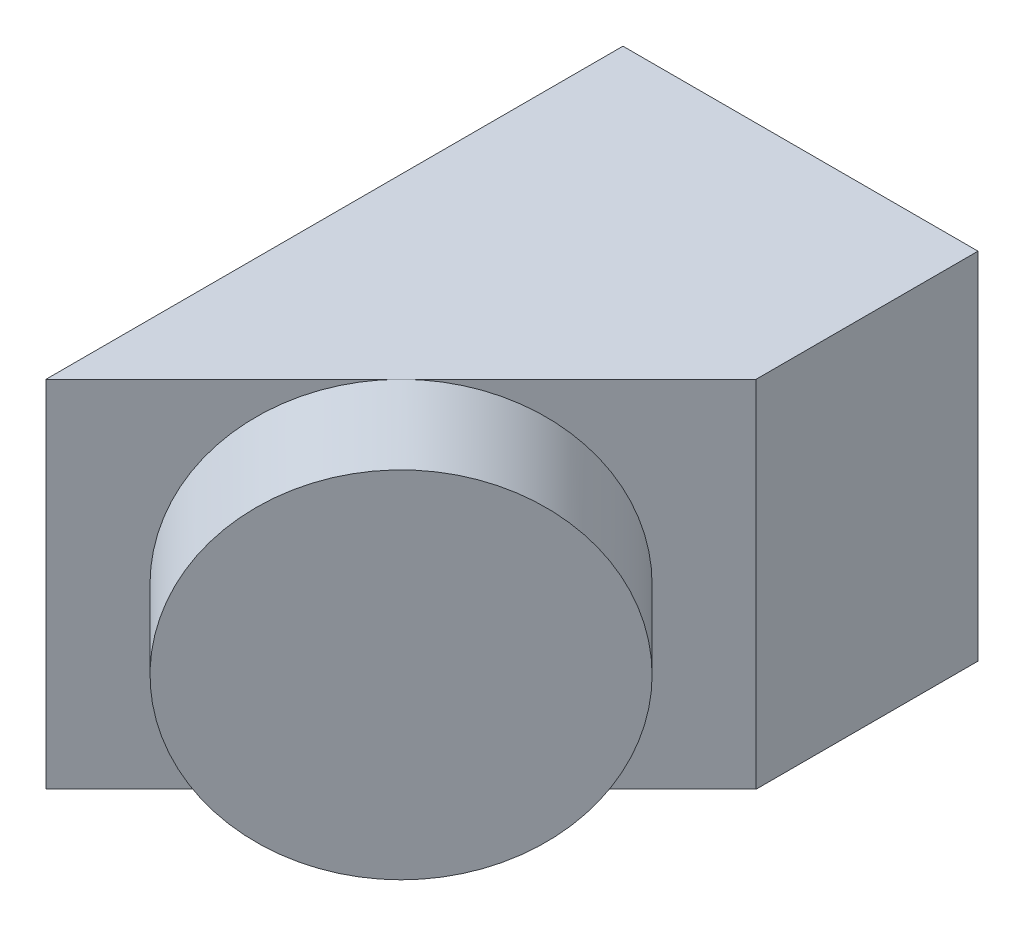
ISO-10303-21;
HEADER;
FILE_DESCRIPTION(('STEP AP214'),'2;1');
FILE_NAME('part.step','',(''),(''),'','','');
FILE_SCHEMA(('AUTOMOTIVE_DESIGN { 1 0 10303 214 1 1 1 1 }'));
ENDSEC;
DATA;
#1=APPLICATION_CONTEXT('core data for automotive mechanical design processes');
#2=APPLICATION_PROTOCOL_DEFINITION('international standard','automotive_design',2000,#1);
#3=PRODUCT_CONTEXT('',#1,'mechanical');
#4=PRODUCT('Part','Part','',(#3));
#5=PRODUCT_RELATED_PRODUCT_CATEGORY('part','',(#4));
#6=PRODUCT_DEFINITION_FORMATION('','',#4);
#7=PRODUCT_DEFINITION_CONTEXT('part definition',#1,'design');
#8=PRODUCT_DEFINITION('design','',#6,#7);
#9=PRODUCT_DEFINITION_SHAPE('','',#8);
#10=(LENGTH_UNIT() NAMED_UNIT(*) SI_UNIT(.MILLI.,.METRE.));
#11=(NAMED_UNIT(*) PLANE_ANGLE_UNIT() SI_UNIT($,.RADIAN.));
#12=(NAMED_UNIT(*) SI_UNIT($,.STERADIAN.) SOLID_ANGLE_UNIT());
#13=UNCERTAINTY_MEASURE_WITH_UNIT(LENGTH_MEASURE(1.E-05),#10,'distance_accuracy_value','');
#14=(GEOMETRIC_REPRESENTATION_CONTEXT(3) GLOBAL_UNCERTAINTY_ASSIGNED_CONTEXT((#13)) GLOBAL_UNIT_ASSIGNED_CONTEXT((#10,
#11,#12)) REPRESENTATION_CONTEXT('',''));
#15=CARTESIAN_POINT('',(0.,0.,0.));
#16=DIRECTION('',(0.,0.,1.));
#17=DIRECTION('',(1.,0.,0.));
#18=AXIS2_PLACEMENT_3D('',#15,#16,#17);
#19=CARTESIAN_POINT('',(0.,16.,26.));
#20=DIRECTION('',(0.707106781186548,0.,0.707106781186548));
#21=DIRECTION('',(0.707106781186548,0.,-0.707106781186548));
#22=AXIS2_PLACEMENT_3D('',#19,#20,#21);
#23=PLANE('',#22);
#24=CARTESIAN_POINT('',(8.00000000000001,8.,18.));
#25=DIRECTION('',(0.707106781186548,0.,0.707106781186547));
#26=DIRECTION('',(0.707106781186547,0.,-0.707106781186548));
#27=AXIS2_PLACEMENT_3D('',#24,#25,#26);
#28=CIRCLE('',#27,8.);
#29=CARTESIAN_POINT('',(8.00000000000001,16.,18.));
#30=VERTEX_POINT('',#29);
#31=CARTESIAN_POINT('',(8.00000000000001,0.,18.));
#32=VERTEX_POINT('',#31);
#33=EDGE_CURVE('E49',#30,#32,#28,.T.);
#34=ORIENTED_EDGE('',*,*,#33,.F.);
#35=DIRECTION('',(-0.707106781186548,0.,0.707106781186548));
#36=VECTOR('',#35,1.);
#37=CARTESIAN_POINT('',(0.,16.,26.));
#38=LINE('',#37,#36);
#39=CARTESIAN_POINT('',(0.,16.,26.));
#40=VERTEX_POINT('',#39);
#41=EDGE_CURVE('E120',#30,#40,#38,.T.);
#42=ORIENTED_EDGE('',*,*,#41,.T.);
#43=DIRECTION('',(0.,-1.,0.));
#44=VECTOR('',#43,1.);
#45=CARTESIAN_POINT('',(0.,16.,26.));
#46=LINE('',#45,#44);
#47=CARTESIAN_POINT('',(0.,0.,26.));
#48=VERTEX_POINT('',#47);
#49=EDGE_CURVE('E119',#40,#48,#46,.T.);
#50=ORIENTED_EDGE('',*,*,#49,.T.);
#51=DIRECTION('',(-0.707106781186548,0.,0.707106781186548));
#52=VECTOR('',#51,1.);
#53=CARTESIAN_POINT('',(0.,0.,26.));
#54=LINE('',#53,#52);
#55=EDGE_CURVE('E132',#32,#48,#54,.T.);
#56=ORIENTED_EDGE('',*,*,#55,.F.);
#57=EDGE_LOOP('',(#34,#42,#50,#56));
#58=FACE_BOUND('',#57,.T.);
#59=ADVANCED_FACE('F39',(#58),#23,.T.);
#60=CARTESIAN_POINT('',(0.,0.,0.));
#61=DIRECTION('',(0.,0.,-1.));
#62=DIRECTION('',(-1.,0.,0.));
#63=AXIS2_PLACEMENT_3D('',#60,#61,#62);
#64=PLANE('',#63);
#65=DIRECTION('',(0.,-1.,0.));
#66=VECTOR('',#65,1.);
#67=CARTESIAN_POINT('',(0.,0.,0.));
#68=LINE('',#67,#66);
#69=CARTESIAN_POINT('',(0.,16.,0.));
#70=VERTEX_POINT('',#69);
#71=CARTESIAN_POINT('',(0.,0.,0.));
#72=VERTEX_POINT('',#71);
#73=EDGE_CURVE('E197',#70,#72,#68,.T.);
#74=ORIENTED_EDGE('',*,*,#73,.F.);
#75=DIRECTION('',(-1.,0.,0.));
#76=VECTOR('',#75,1.);
#77=CARTESIAN_POINT('',(0.,16.,0.));
#78=LINE('',#77,#76);
#79=CARTESIAN_POINT('',(16.,16.,0.));
#80=VERTEX_POINT('',#79);
#81=EDGE_CURVE('E202',#80,#70,#78,.T.);
#82=ORIENTED_EDGE('',*,*,#81,.F.);
#83=DIRECTION('',(0.,1.,0.));
#84=VECTOR('',#83,1.);
#85=CARTESIAN_POINT('',(16.,0.,0.));
#86=LINE('',#85,#84);
#87=CARTESIAN_POINT('',(16.,0.,0.));
#88=VERTEX_POINT('',#87);
#89=EDGE_CURVE('E196',#88,#80,#86,.T.);
#90=ORIENTED_EDGE('',*,*,#89,.F.);
#91=DIRECTION('',(1.,0.,0.));
#92=VECTOR('',#91,1.);
#93=CARTESIAN_POINT('',(0.,0.,0.));
#94=LINE('',#93,#92);
#95=EDGE_CURVE('E189',#72,#88,#94,.T.);
#96=ORIENTED_EDGE('',*,*,#95,.F.);
#97=EDGE_LOOP('',(#74,#82,#90,#96));
#98=FACE_BOUND('',#97,.T.);
#99=DIRECTION('',(-1.,0.,0.));
#100=VECTOR('',#99,1.);
#101=CARTESIAN_POINT('',(3.,13.,0.));
#102=LINE('',#101,#100);
#103=CARTESIAN_POINT('',(13.,13.,0.));
#104=VERTEX_POINT('',#103);
#105=CARTESIAN_POINT('',(3.,13.,0.));
#106=VERTEX_POINT('',#105);
#107=EDGE_CURVE('E219',#104,#106,#102,.T.);
#108=ORIENTED_EDGE('',*,*,#107,.T.);
#109=DIRECTION('',(0.,-1.,0.));
#110=VECTOR('',#109,1.);
#111=CARTESIAN_POINT('',(3.,3.,0.));
#112=LINE('',#111,#110);
#113=CARTESIAN_POINT('',(3.,3.,0.));
#114=VERTEX_POINT('',#113);
#115=EDGE_CURVE('E62',#106,#114,#112,.T.);
#116=ORIENTED_EDGE('',*,*,#115,.T.);
#117=DIRECTION('',(1.,0.,0.));
#118=VECTOR('',#117,1.);
#119=CARTESIAN_POINT('',(3.,3.,0.));
#120=LINE('',#119,#118);
#121=CARTESIAN_POINT('',(13.,3.,0.));
#122=VERTEX_POINT('',#121);
#123=EDGE_CURVE('E226',#114,#122,#120,.T.);
#124=ORIENTED_EDGE('',*,*,#123,.T.);
#125=DIRECTION('',(0.,1.,0.));
#126=VECTOR('',#125,1.);
#127=CARTESIAN_POINT('',(13.,3.,0.));
#128=LINE('',#127,#126);
#129=EDGE_CURVE('E223',#122,#104,#128,.T.);
#130=ORIENTED_EDGE('',*,*,#129,.T.);
#131=EDGE_LOOP('',(#108,#116,#124,#130));
#132=FACE_BOUND('',#131,.T.);
#133=ADVANCED_FACE('F151',(#98,#132),#64,.T.);
#134=CARTESIAN_POINT('',(0.,0.,10.));
#135=DIRECTION('',(1.,0.,0.));
#136=DIRECTION('',(0.,0.,-1.));
#137=AXIS2_PLACEMENT_3D('',#134,#135,#136);
#138=PLANE('',#137);
#139=ORIENTED_EDGE('',*,*,#73,.T.);
#140=DIRECTION('',(0.,0.,-1.));
#141=VECTOR('',#140,1.);
#142=CARTESIAN_POINT('',(0.,0.,10.));
#143=LINE('',#142,#141);
#144=EDGE_CURVE('E43',#48,#72,#143,.T.);
#145=ORIENTED_EDGE('',*,*,#144,.F.);
#146=ORIENTED_EDGE('',*,*,#49,.F.);
#147=DIRECTION('',(0.,0.,-1.));
#148=VECTOR('',#147,1.);
#149=CARTESIAN_POINT('',(0.,16.,10.));
#150=LINE('',#149,#148);
#151=EDGE_CURVE('E126',#40,#70,#150,.T.);
#152=ORIENTED_EDGE('',*,*,#151,.T.);
#153=EDGE_LOOP('',(#139,#145,#146,#152));
#154=FACE_BOUND('',#153,.T.);
#155=ADVANCED_FACE('F41',(#154),#138,.F.);
#156=CARTESIAN_POINT('',(0.,0.,10.));
#157=DIRECTION('',(0.,1.,0.));
#158=DIRECTION('',(0.,0.,1.));
#159=AXIS2_PLACEMENT_3D('',#156,#157,#158);
#160=PLANE('',#159);
#161=ORIENTED_EDGE('',*,*,#95,.T.);
#162=DIRECTION('',(0.,0.,-1.));
#163=VECTOR('',#162,1.);
#164=CARTESIAN_POINT('',(16.,0.,10.));
#165=LINE('',#164,#163);
#166=CARTESIAN_POINT('',(16.,0.,10.));
#167=VERTEX_POINT('',#166);
#168=EDGE_CURVE('E191',#167,#88,#165,.T.);
#169=ORIENTED_EDGE('',*,*,#168,.F.);
#170=EDGE_CURVE('E130',#167,#32,#54,.T.);
#171=ORIENTED_EDGE('',*,*,#170,.T.);
#172=ORIENTED_EDGE('',*,*,#55,.T.);
#173=ORIENTED_EDGE('',*,*,#144,.T.);
#174=EDGE_LOOP('',(#161,#169,#171,#172,#173));
#175=FACE_BOUND('',#174,.T.);
#176=ADVANCED_FACE('F180',(#175),#160,.F.);
#177=CARTESIAN_POINT('',(16.,0.,10.));
#178=DIRECTION('',(-1.,0.,0.));
#179=DIRECTION('',(0.,0.,1.));
#180=AXIS2_PLACEMENT_3D('',#177,#178,#179);
#181=PLANE('',#180);
#182=ORIENTED_EDGE('',*,*,#89,.T.);
#183=DIRECTION('',(0.,0.,-1.));
#184=VECTOR('',#183,1.);
#185=CARTESIAN_POINT('',(16.,16.,10.));
#186=LINE('',#185,#184);
#187=CARTESIAN_POINT('',(16.,16.,10.));
#188=VERTEX_POINT('',#187);
#189=EDGE_CURVE('E199',#188,#80,#186,.T.);
#190=ORIENTED_EDGE('',*,*,#189,.F.);
#191=DIRECTION('',(0.,1.,0.));
#192=VECTOR('',#191,1.);
#193=CARTESIAN_POINT('',(16.,0.,10.));
#194=LINE('',#193,#192);
#195=EDGE_CURVE('E116',#167,#188,#194,.T.);
#196=ORIENTED_EDGE('',*,*,#195,.F.);
#197=ORIENTED_EDGE('',*,*,#168,.T.);
#198=EDGE_LOOP('',(#182,#190,#196,#197));
#199=FACE_BOUND('',#198,.T.);
#200=ADVANCED_FACE('F178',(#199),#181,.F.);
#201=CARTESIAN_POINT('',(0.,16.,10.));
#202=DIRECTION('',(0.,-1.,0.));
#203=DIRECTION('',(0.,0.,-1.));
#204=AXIS2_PLACEMENT_3D('',#201,#202,#203);
#205=PLANE('',#204);
#206=ORIENTED_EDGE('',*,*,#81,.T.);
#207=ORIENTED_EDGE('',*,*,#151,.F.);
#208=ORIENTED_EDGE('',*,*,#41,.F.);
#209=EDGE_CURVE('E112',#188,#30,#38,.T.);
#210=ORIENTED_EDGE('',*,*,#209,.F.);
#211=ORIENTED_EDGE('',*,*,#189,.T.);
#212=EDGE_LOOP('',(#206,#207,#208,#210,#211));
#213=FACE_BOUND('',#212,.T.);
#214=ADVANCED_FACE('F124',(#213),#205,.F.);
#215=CARTESIAN_POINT('',(3.,3.,10.));
#216=DIRECTION('',(1.,0.,0.));
#217=DIRECTION('',(0.,0.,-1.));
#218=AXIS2_PLACEMENT_3D('',#215,#216,#217);
#219=PLANE('',#218);
#220=ORIENTED_EDGE('',*,*,#115,.F.);
#221=DIRECTION('',(0.,0.,-1.));
#222=VECTOR('',#221,1.);
#223=CARTESIAN_POINT('',(3.,13.,10.));
#224=LINE('',#223,#222);
#225=CARTESIAN_POINT('',(3.,13.,10.));
#226=VERTEX_POINT('',#225);
#227=EDGE_CURVE('E216',#226,#106,#224,.T.);
#228=ORIENTED_EDGE('',*,*,#227,.F.);
#229=DIRECTION('',(0.,-1.,0.));
#230=VECTOR('',#229,1.);
#231=CARTESIAN_POINT('',(3.,3.,10.));
#232=LINE('',#231,#230);
#233=CARTESIAN_POINT('',(3.,3.,10.));
#234=VERTEX_POINT('',#233);
#235=EDGE_CURVE('E222',#226,#234,#232,.T.);
#236=ORIENTED_EDGE('',*,*,#235,.T.);
#237=DIRECTION('',(0.,0.,-1.));
#238=VECTOR('',#237,1.);
#239=CARTESIAN_POINT('',(3.,3.,10.));
#240=LINE('',#239,#238);
#241=EDGE_CURVE('E208',#234,#114,#240,.T.);
#242=ORIENTED_EDGE('',*,*,#241,.T.);
#243=EDGE_LOOP('',(#220,#228,#236,#242));
#244=FACE_BOUND('',#243,.T.);
#245=ADVANCED_FACE('F172',(#244),#219,.T.);
#246=CARTESIAN_POINT('',(3.,3.,10.));
#247=DIRECTION('',(0.,1.,0.));
#248=DIRECTION('',(0.,0.,1.));
#249=AXIS2_PLACEMENT_3D('',#246,#247,#248);
#250=PLANE('',#249);
#251=ORIENTED_EDGE('',*,*,#123,.F.);
#252=ORIENTED_EDGE('',*,*,#241,.F.);
#253=DIRECTION('',(1.,0.,0.));
#254=VECTOR('',#253,1.);
#255=CARTESIAN_POINT('',(3.,3.,10.));
#256=LINE('',#255,#254);
#257=CARTESIAN_POINT('',(13.,3.,10.));
#258=VERTEX_POINT('',#257);
#259=EDGE_CURVE('E235',#234,#258,#256,.T.);
#260=ORIENTED_EDGE('',*,*,#259,.T.);
#261=DIRECTION('',(0.,0.,-1.));
#262=VECTOR('',#261,1.);
#263=CARTESIAN_POINT('',(13.,3.,10.));
#264=LINE('',#263,#262);
#265=EDGE_CURVE('E209',#258,#122,#264,.T.);
#266=ORIENTED_EDGE('',*,*,#265,.T.);
#267=EDGE_LOOP('',(#251,#252,#260,#266));
#268=FACE_BOUND('',#267,.T.);
#269=ADVANCED_FACE('F168',(#268),#250,.T.);
#270=CARTESIAN_POINT('',(13.,3.,10.));
#271=DIRECTION('',(-1.,0.,0.));
#272=DIRECTION('',(0.,-1.,0.));
#273=AXIS2_PLACEMENT_3D('',#270,#271,#272);
#274=PLANE('',#273);
#275=ORIENTED_EDGE('',*,*,#129,.F.);
#276=ORIENTED_EDGE('',*,*,#265,.F.);
#277=DIRECTION('',(0.,1.,0.));
#278=VECTOR('',#277,1.);
#279=CARTESIAN_POINT('',(13.,3.,10.));
#280=LINE('',#279,#278);
#281=CARTESIAN_POINT('',(13.,13.,10.));
#282=VERTEX_POINT('',#281);
#283=EDGE_CURVE('E232',#258,#282,#280,.T.);
#284=ORIENTED_EDGE('',*,*,#283,.T.);
#285=DIRECTION('',(0.,0.,-1.));
#286=VECTOR('',#285,1.);
#287=CARTESIAN_POINT('',(13.,13.,10.));
#288=LINE('',#287,#286);
#289=EDGE_CURVE('E214',#282,#104,#288,.T.);
#290=ORIENTED_EDGE('',*,*,#289,.T.);
#291=EDGE_LOOP('',(#275,#276,#284,#290));
#292=FACE_BOUND('',#291,.T.);
#293=ADVANCED_FACE('F164',(#292),#274,.T.);
#294=CARTESIAN_POINT('',(3.,13.,10.));
#295=DIRECTION('',(0.,-1.,0.));
#296=DIRECTION('',(0.,0.,-1.));
#297=AXIS2_PLACEMENT_3D('',#294,#295,#296);
#298=PLANE('',#297);
#299=ORIENTED_EDGE('',*,*,#107,.F.);
#300=ORIENTED_EDGE('',*,*,#289,.F.);
#301=DIRECTION('',(-1.,0.,0.));
#302=VECTOR('',#301,1.);
#303=CARTESIAN_POINT('',(3.,13.,10.));
#304=LINE('',#303,#302);
#305=EDGE_CURVE('E218',#282,#226,#304,.T.);
#306=ORIENTED_EDGE('',*,*,#305,.T.);
#307=ORIENTED_EDGE('',*,*,#227,.T.);
#308=EDGE_LOOP('',(#299,#300,#306,#307));
#309=FACE_BOUND('',#308,.T.);
#310=ADVANCED_FACE('F160',(#309),#298,.T.);
#311=CARTESIAN_POINT('',(16.,16.,10.));
#312=DIRECTION('',(0.,0.,-1.));
#313=DIRECTION('',(-1.,0.,0.));
#314=AXIS2_PLACEMENT_3D('',#311,#312,#313);
#315=PLANE('',#314);
#316=ORIENTED_EDGE('',*,*,#235,.F.);
#317=ORIENTED_EDGE('',*,*,#305,.F.);
#318=ORIENTED_EDGE('',*,*,#283,.F.);
#319=ORIENTED_EDGE('',*,*,#259,.F.);
#320=EDGE_LOOP('',(#316,#317,#318,#319));
#321=FACE_BOUND('',#320,.T.);
#322=ADVANCED_FACE('F147',(#321),#315,.T.);
#323=EDGE_CURVE('E11',#32,#30,#28,.T.);
#324=ORIENTED_EDGE('',*,*,#323,.F.);
#325=ORIENTED_EDGE('',*,*,#170,.F.);
#326=ORIENTED_EDGE('',*,*,#195,.T.);
#327=ORIENTED_EDGE('',*,*,#209,.T.);
#328=EDGE_LOOP('',(#324,#325,#326,#327));
#329=FACE_BOUND('',#328,.T.);
#330=ADVANCED_FACE('F114',(#329),#23,.T.);
#331=CARTESIAN_POINT('',(11.5355339059327,8.,21.5355339059327));
#332=DIRECTION('',(-0.707106781186548,0.,-0.707106781186547));
#333=DIRECTION('',(-0.707106781186547,0.,0.707106781186548));
#334=AXIS2_PLACEMENT_3D('',#331,#332,#333);
#335=CYLINDRICAL_SURFACE('',#334,8.);
#336=CARTESIAN_POINT('',(11.5355339059327,8.,21.5355339059327));
#337=DIRECTION('',(0.707106781186548,0.,0.707106781186547));
#338=DIRECTION('',(0.707106781186547,0.,-0.707106781186548));
#339=AXIS2_PLACEMENT_3D('',#336,#337,#338);
#340=CIRCLE('',#339,8.);
#341=CARTESIAN_POINT('',(17.1923881554251,8.,15.8786796564404));
#342=VERTEX_POINT('',#341);
#343=EDGE_CURVE('E135',#342,#342,#340,.T.);
#344=ORIENTED_EDGE('',*,*,#343,.F.);
#345=EDGE_LOOP('',(#344));
#346=FACE_BOUND('',#345,.T.);
#347=ORIENTED_EDGE('',*,*,#33,.T.);
#348=ORIENTED_EDGE('',*,*,#323,.T.);
#349=EDGE_LOOP('',(#347,#348));
#350=FACE_BOUND('',#349,.T.);
#351=ADVANCED_FACE('F136',(#346,#350),#335,.T.);
#352=CARTESIAN_POINT('',(16.5355339059327,0.,16.5355339059327));
#353=DIRECTION('',(0.707106781186548,0.,0.707106781186547));
#354=DIRECTION('',(0.707106781186547,0.,-0.707106781186548));
#355=AXIS2_PLACEMENT_3D('',#352,#353,#354);
#356=PLANE('',#355);
#357=ORIENTED_EDGE('',*,*,#343,.T.);
#358=EDGE_LOOP('',(#357));
#359=FACE_BOUND('',#358,.T.);
#360=ADVANCED_FACE('F138',(#359),#356,.T.);
#361=CLOSED_SHELL('',(#59,#133,#155,#176,#200,#214,#245,#269,#293,#310,#322,#330,#351,#360));
#362=MANIFOLD_SOLID_BREP('B2',#361);
#363=ADVANCED_BREP_SHAPE_REPRESENTATION('',(#18,#362),#14);
#364=SHAPE_DEFINITION_REPRESENTATION(#9,#363);
ENDSEC;
END-ISO-10303-21;
